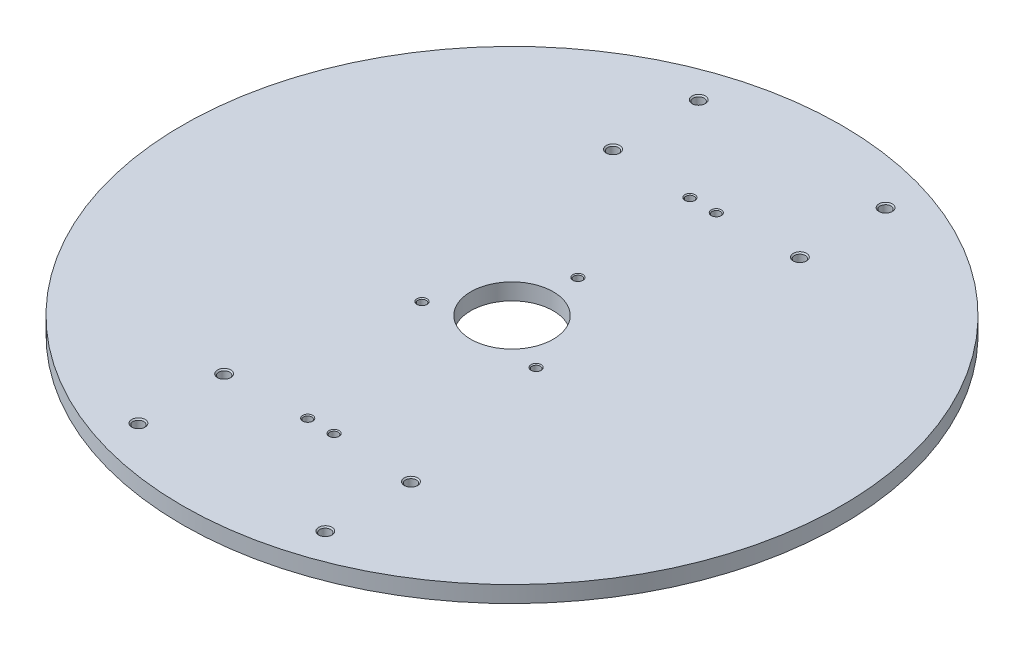
ISO-10303-21;
HEADER;
FILE_DESCRIPTION(('STEP AP214'),'2;1');
FILE_NAME('part.step','',(''),(''),'','','');
FILE_SCHEMA(('AUTOMOTIVE_DESIGN { 1 0 10303 214 1 1 1 1 }'));
ENDSEC;
DATA;
#1=APPLICATION_CONTEXT('core data for automotive mechanical design processes');
#2=APPLICATION_PROTOCOL_DEFINITION('international standard','automotive_design',2000,#1);
#3=PRODUCT_CONTEXT('',#1,'mechanical');
#4=PRODUCT('Part','Part','',(#3));
#5=PRODUCT_RELATED_PRODUCT_CATEGORY('part','',(#4));
#6=PRODUCT_DEFINITION_FORMATION('','',#4);
#7=PRODUCT_DEFINITION_CONTEXT('part definition',#1,'design');
#8=PRODUCT_DEFINITION('design','',#6,#7);
#9=PRODUCT_DEFINITION_SHAPE('','',#8);
#10=(LENGTH_UNIT() NAMED_UNIT(*) SI_UNIT(.MILLI.,.METRE.));
#11=(NAMED_UNIT(*) PLANE_ANGLE_UNIT() SI_UNIT($,.RADIAN.));
#12=(NAMED_UNIT(*) SI_UNIT($,.STERADIAN.) SOLID_ANGLE_UNIT());
#13=UNCERTAINTY_MEASURE_WITH_UNIT(LENGTH_MEASURE(1.E-05),#10,'distance_accuracy_value','');
#14=(GEOMETRIC_REPRESENTATION_CONTEXT(3) GLOBAL_UNCERTAINTY_ASSIGNED_CONTEXT((#13)) GLOBAL_UNIT_ASSIGNED_CONTEXT((#10,
#11,#12)) REPRESENTATION_CONTEXT('',''));
#15=CARTESIAN_POINT('',(0.,0.,0.));
#16=DIRECTION('',(0.,0.,1.));
#17=DIRECTION('',(1.,0.,0.));
#18=AXIS2_PLACEMENT_3D('',#15,#16,#17);
#19=CARTESIAN_POINT('',(0.,5.,0.));
#20=DIRECTION('',(0.,-1.,0.));
#21=DIRECTION('',(0.,0.,-1.));
#22=AXIS2_PLACEMENT_3D('',#19,#20,#21);
#23=CYLINDRICAL_SURFACE('',#22,100.);
#24=CARTESIAN_POINT('',(0.,5.,0.));
#25=DIRECTION('',(0.,1.,0.));
#26=DIRECTION('',(0.,0.,1.));
#27=AXIS2_PLACEMENT_3D('',#24,#25,#26);
#28=CIRCLE('',#27,100.);
#29=CARTESIAN_POINT('',(0.,5.,100.));
#30=VERTEX_POINT('',#29);
#31=EDGE_CURVE('E10',#30,#30,#28,.T.);
#32=ORIENTED_EDGE('',*,*,#31,.F.);
#33=EDGE_LOOP('',(#32));
#34=FACE_BOUND('',#33,.T.);
#35=CARTESIAN_POINT('',(0.,0.,0.));
#36=DIRECTION('',(0.,1.,0.));
#37=DIRECTION('',(0.,0.,1.));
#38=AXIS2_PLACEMENT_3D('',#35,#36,#37);
#39=CIRCLE('',#38,100.);
#40=CARTESIAN_POINT('',(0.,0.,100.));
#41=VERTEX_POINT('',#40);
#42=EDGE_CURVE('E42',#41,#41,#39,.T.);
#43=ORIENTED_EDGE('',*,*,#42,.T.);
#44=EDGE_LOOP('',(#43));
#45=FACE_BOUND('',#44,.T.);
#46=ADVANCED_FACE('F39',(#34,#45),#23,.T.);
#47=CARTESIAN_POINT('',(0.,5.,0.));
#48=DIRECTION('',(0.,1.,0.));
#49=DIRECTION('',(0.,0.,1.));
#50=AXIS2_PLACEMENT_3D('',#47,#48,#49);
#51=PLANE('',#50);
#52=CARTESIAN_POINT('',(-4.,5.,-58.));
#53=DIRECTION('',(0.,1.,0.));
#54=DIRECTION('',(0.,0.,1.));
#55=AXIS2_PLACEMENT_3D('',#52,#53,#54);
#56=CIRCLE('',#55,1.525);
#57=CARTESIAN_POINT('',(-4.,5.,-56.475));
#58=VERTEX_POINT('',#57);
#59=EDGE_CURVE('E188',#58,#58,#56,.T.);
#60=ORIENTED_EDGE('',*,*,#59,.F.);
#61=EDGE_LOOP('',(#60));
#62=FACE_BOUND('',#61,.T.);
#63=CARTESIAN_POINT('',(4.,5.,-58.));
#64=DIRECTION('',(0.,1.,0.));
#65=DIRECTION('',(0.,0.,1.));
#66=AXIS2_PLACEMENT_3D('',#63,#64,#65);
#67=CIRCLE('',#66,1.525);
#68=CARTESIAN_POINT('',(4.,5.,-56.475));
#69=VERTEX_POINT('',#68);
#70=EDGE_CURVE('E179',#69,#69,#67,.T.);
#71=ORIENTED_EDGE('',*,*,#70,.F.);
#72=EDGE_LOOP('',(#71));
#73=FACE_BOUND('',#72,.T.);
#74=CARTESIAN_POINT('',(-4.,5.,58.));
#75=DIRECTION('',(0.,1.,0.));
#76=DIRECTION('',(0.,0.,1.));
#77=AXIS2_PLACEMENT_3D('',#74,#75,#76);
#78=CIRCLE('',#77,1.525);
#79=CARTESIAN_POINT('',(-4.,5.,59.525));
#80=VERTEX_POINT('',#79);
#81=EDGE_CURVE('E170',#80,#80,#78,.T.);
#82=ORIENTED_EDGE('',*,*,#81,.F.);
#83=EDGE_LOOP('',(#82));
#84=FACE_BOUND('',#83,.T.);
#85=CARTESIAN_POINT('',(4.,5.,58.));
#86=DIRECTION('',(0.,1.,0.));
#87=DIRECTION('',(0.,0.,1.));
#88=AXIS2_PLACEMENT_3D('',#85,#86,#87);
#89=CIRCLE('',#88,1.525);
#90=CARTESIAN_POINT('',(4.,5.,59.525));
#91=VERTEX_POINT('',#90);
#92=EDGE_CURVE('E161',#91,#91,#89,.T.);
#93=ORIENTED_EDGE('',*,*,#92,.F.);
#94=EDGE_LOOP('',(#93));
#95=FACE_BOUND('',#94,.T.);
#96=CARTESIAN_POINT('',(-28.35,5.,-85.));
#97=DIRECTION('',(0.,1.,0.));
#98=DIRECTION('',(0.,0.,1.));
#99=AXIS2_PLACEMENT_3D('',#96,#97,#98);
#100=CIRCLE('',#99,2.025);
#101=CARTESIAN_POINT('',(-28.35,5.,-82.975));
#102=VERTEX_POINT('',#101);
#103=EDGE_CURVE('E152',#102,#102,#100,.T.);
#104=ORIENTED_EDGE('',*,*,#103,.F.);
#105=EDGE_LOOP('',(#104));
#106=FACE_BOUND('',#105,.T.);
#107=CARTESIAN_POINT('',(28.35,5.,-85.));
#108=DIRECTION('',(0.,1.,0.));
#109=DIRECTION('',(0.,0.,1.));
#110=AXIS2_PLACEMENT_3D('',#107,#108,#109);
#111=CIRCLE('',#110,2.025);
#112=CARTESIAN_POINT('',(28.35,5.,-82.975));
#113=VERTEX_POINT('',#112);
#114=EDGE_CURVE('E143',#113,#113,#111,.T.);
#115=ORIENTED_EDGE('',*,*,#114,.F.);
#116=EDGE_LOOP('',(#115));
#117=FACE_BOUND('',#116,.T.);
#118=CARTESIAN_POINT('',(28.35,5.,85.));
#119=DIRECTION('',(0.,1.,0.));
#120=DIRECTION('',(0.,0.,1.));
#121=AXIS2_PLACEMENT_3D('',#118,#119,#120);
#122=CIRCLE('',#121,2.025);
#123=CARTESIAN_POINT('',(28.35,5.,87.025));
#124=VERTEX_POINT('',#123);
#125=EDGE_CURVE('E134',#124,#124,#122,.T.);
#126=ORIENTED_EDGE('',*,*,#125,.F.);
#127=EDGE_LOOP('',(#126));
#128=FACE_BOUND('',#127,.T.);
#129=CARTESIAN_POINT('',(-28.35,5.,85.));
#130=DIRECTION('',(0.,1.,0.));
#131=DIRECTION('',(0.,0.,1.));
#132=AXIS2_PLACEMENT_3D('',#129,#130,#131);
#133=CIRCLE('',#132,2.025);
#134=CARTESIAN_POINT('',(-28.35,5.,87.025));
#135=VERTEX_POINT('',#134);
#136=EDGE_CURVE('E125',#135,#135,#133,.T.);
#137=ORIENTED_EDGE('',*,*,#136,.F.);
#138=EDGE_LOOP('',(#137));
#139=FACE_BOUND('',#138,.T.);
#140=CARTESIAN_POINT('',(-28.35,5.,-59.));
#141=DIRECTION('',(0.,1.,0.));
#142=DIRECTION('',(0.,0.,1.));
#143=AXIS2_PLACEMENT_3D('',#140,#141,#142);
#144=CIRCLE('',#143,2.025);
#145=CARTESIAN_POINT('',(-28.35,5.,-56.975));
#146=VERTEX_POINT('',#145);
#147=EDGE_CURVE('E116',#146,#146,#144,.T.);
#148=ORIENTED_EDGE('',*,*,#147,.F.);
#149=EDGE_LOOP('',(#148));
#150=FACE_BOUND('',#149,.T.);
#151=CARTESIAN_POINT('',(28.35,5.,-59.));
#152=DIRECTION('',(0.,1.,0.));
#153=DIRECTION('',(0.,0.,1.));
#154=AXIS2_PLACEMENT_3D('',#151,#152,#153);
#155=CIRCLE('',#154,2.025);
#156=CARTESIAN_POINT('',(28.35,5.,-56.975));
#157=VERTEX_POINT('',#156);
#158=EDGE_CURVE('E107',#157,#157,#155,.T.);
#159=ORIENTED_EDGE('',*,*,#158,.F.);
#160=EDGE_LOOP('',(#159));
#161=FACE_BOUND('',#160,.T.);
#162=CARTESIAN_POINT('',(-28.35,5.,59.));
#163=DIRECTION('',(0.,1.,0.));
#164=DIRECTION('',(0.,0.,1.));
#165=AXIS2_PLACEMENT_3D('',#162,#163,#164);
#166=CIRCLE('',#165,2.025);
#167=CARTESIAN_POINT('',(-28.35,5.,61.025));
#168=VERTEX_POINT('',#167);
#169=EDGE_CURVE('E98',#168,#168,#166,.T.);
#170=ORIENTED_EDGE('',*,*,#169,.F.);
#171=EDGE_LOOP('',(#170));
#172=FACE_BOUND('',#171,.T.);
#173=CARTESIAN_POINT('',(28.35,5.,59.));
#174=DIRECTION('',(0.,1.,0.));
#175=DIRECTION('',(0.,0.,1.));
#176=AXIS2_PLACEMENT_3D('',#173,#174,#175);
#177=CIRCLE('',#176,2.025);
#178=CARTESIAN_POINT('',(28.35,5.,61.025));
#179=VERTEX_POINT('',#178);
#180=EDGE_CURVE('E89',#179,#179,#177,.T.);
#181=ORIENTED_EDGE('',*,*,#180,.F.);
#182=EDGE_LOOP('',(#181));
#183=FACE_BOUND('',#182,.T.);
#184=CARTESIAN_POINT('',(0.,5.,0.));
#185=DIRECTION('',(0.,1.,0.));
#186=DIRECTION('',(0.,0.,1.));
#187=AXIS2_PLACEMENT_3D('',#184,#185,#186);
#188=CIRCLE('',#187,12.5);
#189=CARTESIAN_POINT('',(0.,5.,12.5));
#190=VERTEX_POINT('',#189);
#191=EDGE_CURVE('E78',#190,#190,#188,.T.);
#192=ORIENTED_EDGE('',*,*,#191,.F.);
#193=EDGE_LOOP('',(#192));
#194=FACE_BOUND('',#193,.T.);
#195=CARTESIAN_POINT('',(0.,5.,-20.));
#196=DIRECTION('',(0.,1.,0.));
#197=DIRECTION('',(0.,0.,1.));
#198=AXIS2_PLACEMENT_3D('',#195,#196,#197);
#199=CIRCLE('',#198,1.525);
#200=CARTESIAN_POINT('',(0.,5.,-18.475));
#201=VERTEX_POINT('',#200);
#202=EDGE_CURVE('E74',#201,#201,#199,.T.);
#203=ORIENTED_EDGE('',*,*,#202,.F.);
#204=EDGE_LOOP('',(#203));
#205=FACE_BOUND('',#204,.T.);
#206=CARTESIAN_POINT('',(17.3205080756888,5.,9.99999999999996));
#207=DIRECTION('',(0.,1.,0.));
#208=DIRECTION('',(0.,0.,1.));
#209=AXIS2_PLACEMENT_3D('',#206,#207,#208);
#210=CIRCLE('',#209,1.525);
#211=CARTESIAN_POINT('',(17.3205080756888,5.,11.525));
#212=VERTEX_POINT('',#211);
#213=EDGE_CURVE('E65',#212,#212,#210,.T.);
#214=ORIENTED_EDGE('',*,*,#213,.F.);
#215=EDGE_LOOP('',(#214));
#216=FACE_BOUND('',#215,.T.);
#217=CARTESIAN_POINT('',(-17.3205080756888,5.,9.99999999999997));
#218=DIRECTION('',(0.,1.,0.));
#219=DIRECTION('',(0.,0.,1.));
#220=AXIS2_PLACEMENT_3D('',#217,#218,#219);
#221=CIRCLE('',#220,1.525);
#222=CARTESIAN_POINT('',(-17.3205080756888,5.,11.525));
#223=VERTEX_POINT('',#222);
#224=EDGE_CURVE('E56',#223,#223,#221,.T.);
#225=ORIENTED_EDGE('',*,*,#224,.F.);
#226=EDGE_LOOP('',(#225));
#227=FACE_BOUND('',#226,.T.);
#228=ORIENTED_EDGE('',*,*,#31,.T.);
#229=EDGE_LOOP('',(#228));
#230=FACE_BOUND('',#229,.T.);
#231=ADVANCED_FACE('F194',(#62,#73,#84,#95,#106,#117,#128,#139,#150,#161,#172,#183,#194,#205,
#216,#227,#230),#51,.T.);
#232=CARTESIAN_POINT('',(0.,0.,0.));
#233=DIRECTION('',(0.,1.,0.));
#234=DIRECTION('',(0.,0.,1.));
#235=AXIS2_PLACEMENT_3D('',#232,#233,#234);
#236=PLANE('',#235);
#237=CARTESIAN_POINT('',(-4.,0.,-58.));
#238=DIRECTION('',(0.,1.,0.));
#239=DIRECTION('',(0.,0.,1.));
#240=AXIS2_PLACEMENT_3D('',#237,#238,#239);
#241=CIRCLE('',#240,1.24999999999999);
#242=CARTESIAN_POINT('',(-4.,0.,-56.75));
#243=VERTEX_POINT('',#242);
#244=EDGE_CURVE('E182',#243,#243,#241,.T.);
#245=ORIENTED_EDGE('',*,*,#244,.T.);
#246=EDGE_LOOP('',(#245));
#247=FACE_BOUND('',#246,.T.);
#248=CARTESIAN_POINT('',(4.,0.,-58.));
#249=DIRECTION('',(0.,1.,0.));
#250=DIRECTION('',(0.,0.,1.));
#251=AXIS2_PLACEMENT_3D('',#248,#249,#250);
#252=CIRCLE('',#251,1.24999999999999);
#253=CARTESIAN_POINT('',(4.,0.,-56.75));
#254=VERTEX_POINT('',#253);
#255=EDGE_CURVE('E173',#254,#254,#252,.T.);
#256=ORIENTED_EDGE('',*,*,#255,.T.);
#257=EDGE_LOOP('',(#256));
#258=FACE_BOUND('',#257,.T.);
#259=CARTESIAN_POINT('',(-4.,0.,58.));
#260=DIRECTION('',(0.,1.,0.));
#261=DIRECTION('',(0.,0.,1.));
#262=AXIS2_PLACEMENT_3D('',#259,#260,#261);
#263=CIRCLE('',#262,1.24999999999999);
#264=CARTESIAN_POINT('',(-4.,0.,59.25));
#265=VERTEX_POINT('',#264);
#266=EDGE_CURVE('E164',#265,#265,#263,.T.);
#267=ORIENTED_EDGE('',*,*,#266,.T.);
#268=EDGE_LOOP('',(#267));
#269=FACE_BOUND('',#268,.T.);
#270=CARTESIAN_POINT('',(4.,0.,58.));
#271=DIRECTION('',(0.,1.,0.));
#272=DIRECTION('',(0.,0.,1.));
#273=AXIS2_PLACEMENT_3D('',#270,#271,#272);
#274=CIRCLE('',#273,1.24999999999999);
#275=CARTESIAN_POINT('',(4.,0.,59.25));
#276=VERTEX_POINT('',#275);
#277=EDGE_CURVE('E155',#276,#276,#274,.T.);
#278=ORIENTED_EDGE('',*,*,#277,.T.);
#279=EDGE_LOOP('',(#278));
#280=FACE_BOUND('',#279,.T.);
#281=CARTESIAN_POINT('',(-28.35,0.,-85.));
#282=DIRECTION('',(0.,1.,0.));
#283=DIRECTION('',(0.,0.,1.));
#284=AXIS2_PLACEMENT_3D('',#281,#282,#283);
#285=CIRCLE('',#284,1.64999999999999);
#286=CARTESIAN_POINT('',(-28.35,0.,-83.35));
#287=VERTEX_POINT('',#286);
#288=EDGE_CURVE('E146',#287,#287,#285,.T.);
#289=ORIENTED_EDGE('',*,*,#288,.T.);
#290=EDGE_LOOP('',(#289));
#291=FACE_BOUND('',#290,.T.);
#292=CARTESIAN_POINT('',(28.35,0.,-85.));
#293=DIRECTION('',(0.,1.,0.));
#294=DIRECTION('',(0.,0.,1.));
#295=AXIS2_PLACEMENT_3D('',#292,#293,#294);
#296=CIRCLE('',#295,1.64999999999999);
#297=CARTESIAN_POINT('',(28.35,0.,-83.35));
#298=VERTEX_POINT('',#297);
#299=EDGE_CURVE('E137',#298,#298,#296,.T.);
#300=ORIENTED_EDGE('',*,*,#299,.T.);
#301=EDGE_LOOP('',(#300));
#302=FACE_BOUND('',#301,.T.);
#303=CARTESIAN_POINT('',(28.35,0.,85.));
#304=DIRECTION('',(0.,1.,0.));
#305=DIRECTION('',(0.,0.,1.));
#306=AXIS2_PLACEMENT_3D('',#303,#304,#305);
#307=CIRCLE('',#306,1.64999999999999);
#308=CARTESIAN_POINT('',(28.35,0.,86.65));
#309=VERTEX_POINT('',#308);
#310=EDGE_CURVE('E128',#309,#309,#307,.T.);
#311=ORIENTED_EDGE('',*,*,#310,.T.);
#312=EDGE_LOOP('',(#311));
#313=FACE_BOUND('',#312,.T.);
#314=CARTESIAN_POINT('',(-28.35,0.,85.));
#315=DIRECTION('',(0.,1.,0.));
#316=DIRECTION('',(0.,0.,1.));
#317=AXIS2_PLACEMENT_3D('',#314,#315,#316);
#318=CIRCLE('',#317,1.64999999999999);
#319=CARTESIAN_POINT('',(-28.35,0.,86.65));
#320=VERTEX_POINT('',#319);
#321=EDGE_CURVE('E119',#320,#320,#318,.T.);
#322=ORIENTED_EDGE('',*,*,#321,.T.);
#323=EDGE_LOOP('',(#322));
#324=FACE_BOUND('',#323,.T.);
#325=CARTESIAN_POINT('',(-28.35,0.,-59.));
#326=DIRECTION('',(0.,1.,0.));
#327=DIRECTION('',(0.,0.,1.));
#328=AXIS2_PLACEMENT_3D('',#325,#326,#327);
#329=CIRCLE('',#328,1.64999999999999);
#330=CARTESIAN_POINT('',(-28.35,0.,-57.35));
#331=VERTEX_POINT('',#330);
#332=EDGE_CURVE('E110',#331,#331,#329,.T.);
#333=ORIENTED_EDGE('',*,*,#332,.T.);
#334=EDGE_LOOP('',(#333));
#335=FACE_BOUND('',#334,.T.);
#336=CARTESIAN_POINT('',(28.35,0.,-59.));
#337=DIRECTION('',(0.,1.,0.));
#338=DIRECTION('',(0.,0.,1.));
#339=AXIS2_PLACEMENT_3D('',#336,#337,#338);
#340=CIRCLE('',#339,1.64999999999999);
#341=CARTESIAN_POINT('',(28.35,0.,-57.35));
#342=VERTEX_POINT('',#341);
#343=EDGE_CURVE('E101',#342,#342,#340,.T.);
#344=ORIENTED_EDGE('',*,*,#343,.T.);
#345=EDGE_LOOP('',(#344));
#346=FACE_BOUND('',#345,.T.);
#347=CARTESIAN_POINT('',(-28.35,0.,59.));
#348=DIRECTION('',(0.,1.,0.));
#349=DIRECTION('',(0.,0.,1.));
#350=AXIS2_PLACEMENT_3D('',#347,#348,#349);
#351=CIRCLE('',#350,1.64999999999999);
#352=CARTESIAN_POINT('',(-28.35,0.,60.65));
#353=VERTEX_POINT('',#352);
#354=EDGE_CURVE('E92',#353,#353,#351,.T.);
#355=ORIENTED_EDGE('',*,*,#354,.T.);
#356=EDGE_LOOP('',(#355));
#357=FACE_BOUND('',#356,.T.);
#358=CARTESIAN_POINT('',(28.35,0.,59.));
#359=DIRECTION('',(0.,1.,0.));
#360=DIRECTION('',(0.,0.,1.));
#361=AXIS2_PLACEMENT_3D('',#358,#359,#360);
#362=CIRCLE('',#361,1.64999999999999);
#363=CARTESIAN_POINT('',(28.35,0.,60.65));
#364=VERTEX_POINT('',#363);
#365=EDGE_CURVE('E81',#364,#364,#362,.T.);
#366=ORIENTED_EDGE('',*,*,#365,.T.);
#367=EDGE_LOOP('',(#366));
#368=FACE_BOUND('',#367,.T.);
#369=CARTESIAN_POINT('',(0.,0.,0.));
#370=DIRECTION('',(0.,1.,0.));
#371=DIRECTION('',(0.,0.,1.));
#372=AXIS2_PLACEMENT_3D('',#369,#370,#371);
#373=CIRCLE('',#372,12.5);
#374=CARTESIAN_POINT('',(0.,0.,12.5));
#375=VERTEX_POINT('',#374);
#376=EDGE_CURVE('E77',#375,#375,#373,.T.);
#377=ORIENTED_EDGE('',*,*,#376,.T.);
#378=EDGE_LOOP('',(#377));
#379=FACE_BOUND('',#378,.T.);
#380=CARTESIAN_POINT('',(0.,0.,-20.));
#381=DIRECTION('',(0.,1.,0.));
#382=DIRECTION('',(0.,0.,1.));
#383=AXIS2_PLACEMENT_3D('',#380,#381,#382);
#384=CIRCLE('',#383,1.25);
#385=CARTESIAN_POINT('',(0.,0.,-18.75));
#386=VERTEX_POINT('',#385);
#387=EDGE_CURVE('E68',#386,#386,#384,.T.);
#388=ORIENTED_EDGE('',*,*,#387,.T.);
#389=EDGE_LOOP('',(#388));
#390=FACE_BOUND('',#389,.T.);
#391=CARTESIAN_POINT('',(17.3205080756888,0.,9.99999999999996));
#392=DIRECTION('',(0.,1.,0.));
#393=DIRECTION('',(0.,0.,1.));
#394=AXIS2_PLACEMENT_3D('',#391,#392,#393);
#395=CIRCLE('',#394,1.25);
#396=CARTESIAN_POINT('',(17.3205080756888,0.,11.25));
#397=VERTEX_POINT('',#396);
#398=EDGE_CURVE('E59',#397,#397,#395,.T.);
#399=ORIENTED_EDGE('',*,*,#398,.T.);
#400=EDGE_LOOP('',(#399));
#401=FACE_BOUND('',#400,.T.);
#402=CARTESIAN_POINT('',(-17.3205080756888,0.,9.99999999999997));
#403=DIRECTION('',(0.,1.,0.));
#404=DIRECTION('',(0.,0.,1.));
#405=AXIS2_PLACEMENT_3D('',#402,#403,#404);
#406=CIRCLE('',#405,1.25);
#407=CARTESIAN_POINT('',(-17.3205080756888,0.,11.25));
#408=VERTEX_POINT('',#407);
#409=EDGE_CURVE('E49',#408,#408,#406,.T.);
#410=ORIENTED_EDGE('',*,*,#409,.T.);
#411=EDGE_LOOP('',(#410));
#412=FACE_BOUND('',#411,.T.);
#413=ORIENTED_EDGE('',*,*,#42,.F.);
#414=EDGE_LOOP('',(#413));
#415=FACE_BOUND('',#414,.T.);
#416=ADVANCED_FACE('F197',(#247,#258,#269,#280,#291,#302,#313,#324,#335,#346,#357,#368,#379,
#390,#401,#412,#415),#236,.F.);
#417=CARTESIAN_POINT('',(-17.3205080756888,5.,9.99999999999997));
#418=DIRECTION('',(0.,1.,0.));
#419=DIRECTION('',(0.,0.,1.));
#420=AXIS2_PLACEMENT_3D('',#417,#418,#419);
#421=CYLINDRICAL_SURFACE('',#420,1.25);
#422=ORIENTED_EDGE('',*,*,#409,.F.);
#423=EDGE_LOOP('',(#422));
#424=FACE_BOUND('',#423,.T.);
#425=CARTESIAN_POINT('',(-17.3205080756888,4.725,9.99999999999997));
#426=DIRECTION('',(0.,1.,0.));
#427=DIRECTION('',(0.,0.,1.));
#428=AXIS2_PLACEMENT_3D('',#425,#426,#427);
#429=CIRCLE('',#428,1.25);
#430=CARTESIAN_POINT('',(-17.3205080756888,4.725,11.25));
#431=VERTEX_POINT('',#430);
#432=EDGE_CURVE('E53',#431,#431,#429,.T.);
#433=ORIENTED_EDGE('',*,*,#432,.T.);
#434=EDGE_LOOP('',(#433));
#435=FACE_BOUND('',#434,.T.);
#436=ADVANCED_FACE('F232',(#424,#435),#421,.F.);
#437=CARTESIAN_POINT('',(-17.3205080756888,5.,9.99999999999997));
#438=DIRECTION('',(0.,1.,0.));
#439=DIRECTION('',(0.,0.,1.));
#440=AXIS2_PLACEMENT_3D('',#437,#438,#439);
#441=CONICAL_SURFACE('',#440,1.525,0.785398163397439);
#442=ORIENTED_EDGE('',*,*,#432,.F.);
#443=EDGE_LOOP('',(#442));
#444=FACE_BOUND('',#443,.T.);
#445=ORIENTED_EDGE('',*,*,#224,.T.);
#446=EDGE_LOOP('',(#445));
#447=FACE_BOUND('',#446,.T.);
#448=ADVANCED_FACE('F229',(#444,#447),#441,.F.);
#449=CARTESIAN_POINT('',(17.3205080756888,5.,9.99999999999996));
#450=DIRECTION('',(0.,1.,0.));
#451=DIRECTION('',(0.,0.,1.));
#452=AXIS2_PLACEMENT_3D('',#449,#450,#451);
#453=CYLINDRICAL_SURFACE('',#452,1.25);
#454=ORIENTED_EDGE('',*,*,#398,.F.);
#455=EDGE_LOOP('',(#454));
#456=FACE_BOUND('',#455,.T.);
#457=CARTESIAN_POINT('',(17.3205080756888,4.725,9.99999999999996));
#458=DIRECTION('',(0.,1.,0.));
#459=DIRECTION('',(0.,0.,1.));
#460=AXIS2_PLACEMENT_3D('',#457,#458,#459);
#461=CIRCLE('',#460,1.25);
#462=CARTESIAN_POINT('',(17.3205080756888,4.725,11.25));
#463=VERTEX_POINT('',#462);
#464=EDGE_CURVE('E62',#463,#463,#461,.T.);
#465=ORIENTED_EDGE('',*,*,#464,.T.);
#466=EDGE_LOOP('',(#465));
#467=FACE_BOUND('',#466,.T.);
#468=ADVANCED_FACE('F231',(#456,#467),#453,.F.);
#469=CARTESIAN_POINT('',(17.3205080756888,5.,9.99999999999996));
#470=DIRECTION('',(0.,1.,0.));
#471=DIRECTION('',(0.,0.,1.));
#472=AXIS2_PLACEMENT_3D('',#469,#470,#471);
#473=CONICAL_SURFACE('',#472,1.525,0.785398163397439);
#474=ORIENTED_EDGE('',*,*,#464,.F.);
#475=EDGE_LOOP('',(#474));
#476=FACE_BOUND('',#475,.T.);
#477=ORIENTED_EDGE('',*,*,#213,.T.);
#478=EDGE_LOOP('',(#477));
#479=FACE_BOUND('',#478,.T.);
#480=ADVANCED_FACE('F240',(#476,#479),#473,.F.);
#481=CARTESIAN_POINT('',(0.,5.,-20.));
#482=DIRECTION('',(0.,1.,0.));
#483=DIRECTION('',(0.,0.,1.));
#484=AXIS2_PLACEMENT_3D('',#481,#482,#483);
#485=CYLINDRICAL_SURFACE('',#484,1.25);
#486=ORIENTED_EDGE('',*,*,#387,.F.);
#487=EDGE_LOOP('',(#486));
#488=FACE_BOUND('',#487,.T.);
#489=CARTESIAN_POINT('',(0.,4.725,-20.));
#490=DIRECTION('',(0.,1.,0.));
#491=DIRECTION('',(0.,0.,1.));
#492=AXIS2_PLACEMENT_3D('',#489,#490,#491);
#493=CIRCLE('',#492,1.25);
#494=CARTESIAN_POINT('',(0.,4.725,-18.75));
#495=VERTEX_POINT('',#494);
#496=EDGE_CURVE('E71',#495,#495,#493,.T.);
#497=ORIENTED_EDGE('',*,*,#496,.T.);
#498=EDGE_LOOP('',(#497));
#499=FACE_BOUND('',#498,.T.);
#500=ADVANCED_FACE('F296',(#488,#499),#485,.F.);
#501=CARTESIAN_POINT('',(0.,5.,-20.));
#502=DIRECTION('',(0.,1.,0.));
#503=DIRECTION('',(0.,0.,1.));
#504=AXIS2_PLACEMENT_3D('',#501,#502,#503);
#505=CONICAL_SURFACE('',#504,1.525,0.785398163397445);
#506=ORIENTED_EDGE('',*,*,#496,.F.);
#507=EDGE_LOOP('',(#506));
#508=FACE_BOUND('',#507,.T.);
#509=ORIENTED_EDGE('',*,*,#202,.T.);
#510=EDGE_LOOP('',(#509));
#511=FACE_BOUND('',#510,.T.);
#512=ADVANCED_FACE('F302',(#508,#511),#505,.F.);
#513=CARTESIAN_POINT('',(0.,0.,0.));
#514=DIRECTION('',(0.,1.,0.));
#515=DIRECTION('',(0.,0.,1.));
#516=AXIS2_PLACEMENT_3D('',#513,#514,#515);
#517=CYLINDRICAL_SURFACE('',#516,12.5);
#518=ORIENTED_EDGE('',*,*,#376,.F.);
#519=EDGE_LOOP('',(#518));
#520=FACE_BOUND('',#519,.T.);
#521=ORIENTED_EDGE('',*,*,#191,.T.);
#522=EDGE_LOOP('',(#521));
#523=FACE_BOUND('',#522,.T.);
#524=ADVANCED_FACE('F308',(#520,#523),#517,.F.);
#525=CARTESIAN_POINT('',(28.35,5.,59.));
#526=DIRECTION('',(0.,1.,0.));
#527=DIRECTION('',(0.,0.,1.));
#528=AXIS2_PLACEMENT_3D('',#525,#526,#527);
#529=CYLINDRICAL_SURFACE('',#528,1.64999999999999);
#530=ORIENTED_EDGE('',*,*,#365,.F.);
#531=EDGE_LOOP('',(#530));
#532=FACE_BOUND('',#531,.T.);
#533=CARTESIAN_POINT('',(28.35,4.625,59.));
#534=DIRECTION('',(0.,1.,0.));
#535=DIRECTION('',(0.,0.,1.));
#536=AXIS2_PLACEMENT_3D('',#533,#534,#535);
#537=CIRCLE('',#536,1.64999999999999);
#538=CARTESIAN_POINT('',(28.35,4.625,60.65));
#539=VERTEX_POINT('',#538);
#540=EDGE_CURVE('E86',#539,#539,#537,.T.);
#541=ORIENTED_EDGE('',*,*,#540,.T.);
#542=EDGE_LOOP('',(#541));
#543=FACE_BOUND('',#542,.T.);
#544=ADVANCED_FACE('F312',(#532,#543),#529,.F.);
#545=CARTESIAN_POINT('',(28.35,5.,59.));
#546=DIRECTION('',(0.,1.,0.));
#547=DIRECTION('',(0.,0.,1.));
#548=AXIS2_PLACEMENT_3D('',#545,#546,#547);
#549=CONICAL_SURFACE('',#548,2.025,0.78539816339746);
#550=ORIENTED_EDGE('',*,*,#540,.F.);
#551=EDGE_LOOP('',(#550));
#552=FACE_BOUND('',#551,.T.);
#553=ORIENTED_EDGE('',*,*,#180,.T.);
#554=EDGE_LOOP('',(#553));
#555=FACE_BOUND('',#554,.T.);
#556=ADVANCED_FACE('F316',(#552,#555),#549,.F.);
#557=CARTESIAN_POINT('',(-28.35,5.,59.));
#558=DIRECTION('',(0.,1.,0.));
#559=DIRECTION('',(0.,0.,1.));
#560=AXIS2_PLACEMENT_3D('',#557,#558,#559);
#561=CYLINDRICAL_SURFACE('',#560,1.64999999999999);
#562=ORIENTED_EDGE('',*,*,#354,.F.);
#563=EDGE_LOOP('',(#562));
#564=FACE_BOUND('',#563,.T.);
#565=CARTESIAN_POINT('',(-28.35,4.625,59.));
#566=DIRECTION('',(0.,1.,0.));
#567=DIRECTION('',(0.,0.,1.));
#568=AXIS2_PLACEMENT_3D('',#565,#566,#567);
#569=CIRCLE('',#568,1.64999999999999);
#570=CARTESIAN_POINT('',(-28.35,4.625,60.65));
#571=VERTEX_POINT('',#570);
#572=EDGE_CURVE('E95',#571,#571,#569,.T.);
#573=ORIENTED_EDGE('',*,*,#572,.T.);
#574=EDGE_LOOP('',(#573));
#575=FACE_BOUND('',#574,.T.);
#576=ADVANCED_FACE('F320',(#564,#575),#561,.F.);
#577=CARTESIAN_POINT('',(-28.35,5.,59.));
#578=DIRECTION('',(0.,1.,0.));
#579=DIRECTION('',(0.,0.,1.));
#580=AXIS2_PLACEMENT_3D('',#577,#578,#579);
#581=CONICAL_SURFACE('',#580,2.025,0.78539816339746);
#582=ORIENTED_EDGE('',*,*,#572,.F.);
#583=EDGE_LOOP('',(#582));
#584=FACE_BOUND('',#583,.T.);
#585=ORIENTED_EDGE('',*,*,#169,.T.);
#586=EDGE_LOOP('',(#585));
#587=FACE_BOUND('',#586,.T.);
#588=ADVANCED_FACE('F324',(#584,#587),#581,.F.);
#589=CARTESIAN_POINT('',(28.35,5.,-59.));
#590=DIRECTION('',(0.,1.,0.));
#591=DIRECTION('',(0.,0.,1.));
#592=AXIS2_PLACEMENT_3D('',#589,#590,#591);
#593=CYLINDRICAL_SURFACE('',#592,1.64999999999999);
#594=ORIENTED_EDGE('',*,*,#343,.F.);
#595=EDGE_LOOP('',(#594));
#596=FACE_BOUND('',#595,.T.);
#597=CARTESIAN_POINT('',(28.35,4.625,-59.));
#598=DIRECTION('',(0.,1.,0.));
#599=DIRECTION('',(0.,0.,1.));
#600=AXIS2_PLACEMENT_3D('',#597,#598,#599);
#601=CIRCLE('',#600,1.64999999999999);
#602=CARTESIAN_POINT('',(28.35,4.625,-57.35));
#603=VERTEX_POINT('',#602);
#604=EDGE_CURVE('E104',#603,#603,#601,.T.);
#605=ORIENTED_EDGE('',*,*,#604,.T.);
#606=EDGE_LOOP('',(#605));
#607=FACE_BOUND('',#606,.T.);
#608=ADVANCED_FACE('F328',(#596,#607),#593,.F.);
#609=CARTESIAN_POINT('',(28.35,5.,-59.));
#610=DIRECTION('',(0.,1.,0.));
#611=DIRECTION('',(0.,0.,1.));
#612=AXIS2_PLACEMENT_3D('',#609,#610,#611);
#613=CONICAL_SURFACE('',#612,2.025,0.78539816339746);
#614=ORIENTED_EDGE('',*,*,#604,.F.);
#615=EDGE_LOOP('',(#614));
#616=FACE_BOUND('',#615,.T.);
#617=ORIENTED_EDGE('',*,*,#158,.T.);
#618=EDGE_LOOP('',(#617));
#619=FACE_BOUND('',#618,.T.);
#620=ADVANCED_FACE('F332',(#616,#619),#613,.F.);
#621=CARTESIAN_POINT('',(-28.35,5.,-59.));
#622=DIRECTION('',(0.,1.,0.));
#623=DIRECTION('',(0.,0.,1.));
#624=AXIS2_PLACEMENT_3D('',#621,#622,#623);
#625=CYLINDRICAL_SURFACE('',#624,1.64999999999999);
#626=ORIENTED_EDGE('',*,*,#332,.F.);
#627=EDGE_LOOP('',(#626));
#628=FACE_BOUND('',#627,.T.);
#629=CARTESIAN_POINT('',(-28.35,4.625,-59.));
#630=DIRECTION('',(0.,1.,0.));
#631=DIRECTION('',(0.,0.,1.));
#632=AXIS2_PLACEMENT_3D('',#629,#630,#631);
#633=CIRCLE('',#632,1.64999999999999);
#634=CARTESIAN_POINT('',(-28.35,4.625,-57.35));
#635=VERTEX_POINT('',#634);
#636=EDGE_CURVE('E113',#635,#635,#633,.T.);
#637=ORIENTED_EDGE('',*,*,#636,.T.);
#638=EDGE_LOOP('',(#637));
#639=FACE_BOUND('',#638,.T.);
#640=ADVANCED_FACE('F336',(#628,#639),#625,.F.);
#641=CARTESIAN_POINT('',(-28.35,5.,-59.));
#642=DIRECTION('',(0.,1.,0.));
#643=DIRECTION('',(0.,0.,1.));
#644=AXIS2_PLACEMENT_3D('',#641,#642,#643);
#645=CONICAL_SURFACE('',#644,2.025,0.78539816339746);
#646=ORIENTED_EDGE('',*,*,#636,.F.);
#647=EDGE_LOOP('',(#646));
#648=FACE_BOUND('',#647,.T.);
#649=ORIENTED_EDGE('',*,*,#147,.T.);
#650=EDGE_LOOP('',(#649));
#651=FACE_BOUND('',#650,.T.);
#652=ADVANCED_FACE('F340',(#648,#651),#645,.F.);
#653=CARTESIAN_POINT('',(-28.35,5.,85.));
#654=DIRECTION('',(0.,1.,0.));
#655=DIRECTION('',(0.,0.,1.));
#656=AXIS2_PLACEMENT_3D('',#653,#654,#655);
#657=CYLINDRICAL_SURFACE('',#656,1.64999999999999);
#658=ORIENTED_EDGE('',*,*,#321,.F.);
#659=EDGE_LOOP('',(#658));
#660=FACE_BOUND('',#659,.T.);
#661=CARTESIAN_POINT('',(-28.35,4.625,85.));
#662=DIRECTION('',(0.,1.,0.));
#663=DIRECTION('',(0.,0.,1.));
#664=AXIS2_PLACEMENT_3D('',#661,#662,#663);
#665=CIRCLE('',#664,1.64999999999999);
#666=CARTESIAN_POINT('',(-28.35,4.625,86.65));
#667=VERTEX_POINT('',#666);
#668=EDGE_CURVE('E122',#667,#667,#665,.T.);
#669=ORIENTED_EDGE('',*,*,#668,.T.);
#670=EDGE_LOOP('',(#669));
#671=FACE_BOUND('',#670,.T.);
#672=ADVANCED_FACE('F344',(#660,#671),#657,.F.);
#673=CARTESIAN_POINT('',(-28.35,5.,85.));
#674=DIRECTION('',(0.,1.,0.));
#675=DIRECTION('',(0.,0.,1.));
#676=AXIS2_PLACEMENT_3D('',#673,#674,#675);
#677=CONICAL_SURFACE('',#676,2.025,0.78539816339746);
#678=ORIENTED_EDGE('',*,*,#668,.F.);
#679=EDGE_LOOP('',(#678));
#680=FACE_BOUND('',#679,.T.);
#681=ORIENTED_EDGE('',*,*,#136,.T.);
#682=EDGE_LOOP('',(#681));
#683=FACE_BOUND('',#682,.T.);
#684=ADVANCED_FACE('F348',(#680,#683),#677,.F.);
#685=CARTESIAN_POINT('',(28.35,5.,85.));
#686=DIRECTION('',(0.,1.,0.));
#687=DIRECTION('',(0.,0.,1.));
#688=AXIS2_PLACEMENT_3D('',#685,#686,#687);
#689=CYLINDRICAL_SURFACE('',#688,1.64999999999999);
#690=ORIENTED_EDGE('',*,*,#310,.F.);
#691=EDGE_LOOP('',(#690));
#692=FACE_BOUND('',#691,.T.);
#693=CARTESIAN_POINT('',(28.35,4.625,85.));
#694=DIRECTION('',(0.,1.,0.));
#695=DIRECTION('',(0.,0.,1.));
#696=AXIS2_PLACEMENT_3D('',#693,#694,#695);
#697=CIRCLE('',#696,1.64999999999999);
#698=CARTESIAN_POINT('',(28.35,4.625,86.65));
#699=VERTEX_POINT('',#698);
#700=EDGE_CURVE('E131',#699,#699,#697,.T.);
#701=ORIENTED_EDGE('',*,*,#700,.T.);
#702=EDGE_LOOP('',(#701));
#703=FACE_BOUND('',#702,.T.);
#704=ADVANCED_FACE('F352',(#692,#703),#689,.F.);
#705=CARTESIAN_POINT('',(28.35,5.,85.));
#706=DIRECTION('',(0.,1.,0.));
#707=DIRECTION('',(0.,0.,1.));
#708=AXIS2_PLACEMENT_3D('',#705,#706,#707);
#709=CONICAL_SURFACE('',#708,2.025,0.78539816339746);
#710=ORIENTED_EDGE('',*,*,#700,.F.);
#711=EDGE_LOOP('',(#710));
#712=FACE_BOUND('',#711,.T.);
#713=ORIENTED_EDGE('',*,*,#125,.T.);
#714=EDGE_LOOP('',(#713));
#715=FACE_BOUND('',#714,.T.);
#716=ADVANCED_FACE('F356',(#712,#715),#709,.F.);
#717=CARTESIAN_POINT('',(28.35,5.,-85.));
#718=DIRECTION('',(0.,1.,0.));
#719=DIRECTION('',(0.,0.,1.));
#720=AXIS2_PLACEMENT_3D('',#717,#718,#719);
#721=CYLINDRICAL_SURFACE('',#720,1.64999999999999);
#722=ORIENTED_EDGE('',*,*,#299,.F.);
#723=EDGE_LOOP('',(#722));
#724=FACE_BOUND('',#723,.T.);
#725=CARTESIAN_POINT('',(28.35,4.625,-85.));
#726=DIRECTION('',(0.,1.,0.));
#727=DIRECTION('',(0.,0.,1.));
#728=AXIS2_PLACEMENT_3D('',#725,#726,#727);
#729=CIRCLE('',#728,1.64999999999999);
#730=CARTESIAN_POINT('',(28.35,4.625,-83.35));
#731=VERTEX_POINT('',#730);
#732=EDGE_CURVE('E140',#731,#731,#729,.T.);
#733=ORIENTED_EDGE('',*,*,#732,.T.);
#734=EDGE_LOOP('',(#733));
#735=FACE_BOUND('',#734,.T.);
#736=ADVANCED_FACE('F360',(#724,#735),#721,.F.);
#737=CARTESIAN_POINT('',(28.35,5.,-85.));
#738=DIRECTION('',(0.,1.,0.));
#739=DIRECTION('',(0.,0.,1.));
#740=AXIS2_PLACEMENT_3D('',#737,#738,#739);
#741=CONICAL_SURFACE('',#740,2.025,0.78539816339746);
#742=ORIENTED_EDGE('',*,*,#732,.F.);
#743=EDGE_LOOP('',(#742));
#744=FACE_BOUND('',#743,.T.);
#745=ORIENTED_EDGE('',*,*,#114,.T.);
#746=EDGE_LOOP('',(#745));
#747=FACE_BOUND('',#746,.T.);
#748=ADVANCED_FACE('F364',(#744,#747),#741,.F.);
#749=CARTESIAN_POINT('',(-28.35,5.,-85.));
#750=DIRECTION('',(0.,1.,0.));
#751=DIRECTION('',(0.,0.,1.));
#752=AXIS2_PLACEMENT_3D('',#749,#750,#751);
#753=CYLINDRICAL_SURFACE('',#752,1.64999999999999);
#754=ORIENTED_EDGE('',*,*,#288,.F.);
#755=EDGE_LOOP('',(#754));
#756=FACE_BOUND('',#755,.T.);
#757=CARTESIAN_POINT('',(-28.35,4.625,-85.));
#758=DIRECTION('',(0.,1.,0.));
#759=DIRECTION('',(0.,0.,1.));
#760=AXIS2_PLACEMENT_3D('',#757,#758,#759);
#761=CIRCLE('',#760,1.64999999999999);
#762=CARTESIAN_POINT('',(-28.35,4.625,-83.35));
#763=VERTEX_POINT('',#762);
#764=EDGE_CURVE('E149',#763,#763,#761,.T.);
#765=ORIENTED_EDGE('',*,*,#764,.T.);
#766=EDGE_LOOP('',(#765));
#767=FACE_BOUND('',#766,.T.);
#768=ADVANCED_FACE('F368',(#756,#767),#753,.F.);
#769=CARTESIAN_POINT('',(-28.35,5.,-85.));
#770=DIRECTION('',(0.,1.,0.));
#771=DIRECTION('',(0.,0.,1.));
#772=AXIS2_PLACEMENT_3D('',#769,#770,#771);
#773=CONICAL_SURFACE('',#772,2.025,0.78539816339746);
#774=ORIENTED_EDGE('',*,*,#764,.F.);
#775=EDGE_LOOP('',(#774));
#776=FACE_BOUND('',#775,.T.);
#777=ORIENTED_EDGE('',*,*,#103,.T.);
#778=EDGE_LOOP('',(#777));
#779=FACE_BOUND('',#778,.T.);
#780=ADVANCED_FACE('F372',(#776,#779),#773,.F.);
#781=CARTESIAN_POINT('',(4.,5.,58.));
#782=DIRECTION('',(0.,1.,0.));
#783=DIRECTION('',(0.,0.,1.));
#784=AXIS2_PLACEMENT_3D('',#781,#782,#783);
#785=CYLINDRICAL_SURFACE('',#784,1.24999999999999);
#786=ORIENTED_EDGE('',*,*,#277,.F.);
#787=EDGE_LOOP('',(#786));
#788=FACE_BOUND('',#787,.T.);
#789=CARTESIAN_POINT('',(4.,4.72499999999999,58.));
#790=DIRECTION('',(0.,1.,0.));
#791=DIRECTION('',(0.,0.,1.));
#792=AXIS2_PLACEMENT_3D('',#789,#790,#791);
#793=CIRCLE('',#792,1.24999999999999);
#794=CARTESIAN_POINT('',(4.,4.72499999999999,59.25));
#795=VERTEX_POINT('',#794);
#796=EDGE_CURVE('E158',#795,#795,#793,.T.);
#797=ORIENTED_EDGE('',*,*,#796,.T.);
#798=EDGE_LOOP('',(#797));
#799=FACE_BOUND('',#798,.T.);
#800=ADVANCED_FACE('F376',(#788,#799),#785,.F.);
#801=CARTESIAN_POINT('',(4.,5.,58.));
#802=DIRECTION('',(0.,1.,0.));
#803=DIRECTION('',(0.,0.,1.));
#804=AXIS2_PLACEMENT_3D('',#801,#802,#803);
#805=CONICAL_SURFACE('',#804,1.525,0.785398163397448);
#806=ORIENTED_EDGE('',*,*,#796,.F.);
#807=EDGE_LOOP('',(#806));
#808=FACE_BOUND('',#807,.T.);
#809=ORIENTED_EDGE('',*,*,#92,.T.);
#810=EDGE_LOOP('',(#809));
#811=FACE_BOUND('',#810,.T.);
#812=ADVANCED_FACE('F380',(#808,#811),#805,.F.);
#813=CARTESIAN_POINT('',(-4.,5.,58.));
#814=DIRECTION('',(0.,1.,0.));
#815=DIRECTION('',(0.,0.,1.));
#816=AXIS2_PLACEMENT_3D('',#813,#814,#815);
#817=CYLINDRICAL_SURFACE('',#816,1.24999999999999);
#818=ORIENTED_EDGE('',*,*,#266,.F.);
#819=EDGE_LOOP('',(#818));
#820=FACE_BOUND('',#819,.T.);
#821=CARTESIAN_POINT('',(-4.,4.72499999999999,58.));
#822=DIRECTION('',(0.,1.,0.));
#823=DIRECTION('',(0.,0.,1.));
#824=AXIS2_PLACEMENT_3D('',#821,#822,#823);
#825=CIRCLE('',#824,1.24999999999999);
#826=CARTESIAN_POINT('',(-4.,4.72499999999999,59.25));
#827=VERTEX_POINT('',#826);
#828=EDGE_CURVE('E167',#827,#827,#825,.T.);
#829=ORIENTED_EDGE('',*,*,#828,.T.);
#830=EDGE_LOOP('',(#829));
#831=FACE_BOUND('',#830,.T.);
#832=ADVANCED_FACE('F384',(#820,#831),#817,.F.);
#833=CARTESIAN_POINT('',(-4.,5.,58.));
#834=DIRECTION('',(0.,1.,0.));
#835=DIRECTION('',(0.,0.,1.));
#836=AXIS2_PLACEMENT_3D('',#833,#834,#835);
#837=CONICAL_SURFACE('',#836,1.525,0.785398163397448);
#838=ORIENTED_EDGE('',*,*,#828,.F.);
#839=EDGE_LOOP('',(#838));
#840=FACE_BOUND('',#839,.T.);
#841=ORIENTED_EDGE('',*,*,#81,.T.);
#842=EDGE_LOOP('',(#841));
#843=FACE_BOUND('',#842,.T.);
#844=ADVANCED_FACE('F388',(#840,#843),#837,.F.);
#845=CARTESIAN_POINT('',(4.,5.,-58.));
#846=DIRECTION('',(0.,1.,0.));
#847=DIRECTION('',(0.,0.,1.));
#848=AXIS2_PLACEMENT_3D('',#845,#846,#847);
#849=CYLINDRICAL_SURFACE('',#848,1.24999999999999);
#850=ORIENTED_EDGE('',*,*,#255,.F.);
#851=EDGE_LOOP('',(#850));
#852=FACE_BOUND('',#851,.T.);
#853=CARTESIAN_POINT('',(4.,4.72499999999999,-58.));
#854=DIRECTION('',(0.,1.,0.));
#855=DIRECTION('',(0.,0.,1.));
#856=AXIS2_PLACEMENT_3D('',#853,#854,#855);
#857=CIRCLE('',#856,1.24999999999999);
#858=CARTESIAN_POINT('',(4.,4.72499999999999,-56.75));
#859=VERTEX_POINT('',#858);
#860=EDGE_CURVE('E176',#859,#859,#857,.T.);
#861=ORIENTED_EDGE('',*,*,#860,.T.);
#862=EDGE_LOOP('',(#861));
#863=FACE_BOUND('',#862,.T.);
#864=ADVANCED_FACE('F392',(#852,#863),#849,.F.);
#865=CARTESIAN_POINT('',(4.,5.,-58.));
#866=DIRECTION('',(0.,1.,0.));
#867=DIRECTION('',(0.,0.,1.));
#868=AXIS2_PLACEMENT_3D('',#865,#866,#867);
#869=CONICAL_SURFACE('',#868,1.525,0.785398163397448);
#870=ORIENTED_EDGE('',*,*,#860,.F.);
#871=EDGE_LOOP('',(#870));
#872=FACE_BOUND('',#871,.T.);
#873=ORIENTED_EDGE('',*,*,#70,.T.);
#874=EDGE_LOOP('',(#873));
#875=FACE_BOUND('',#874,.T.);
#876=ADVANCED_FACE('F396',(#872,#875),#869,.F.);
#877=CARTESIAN_POINT('',(-4.,5.,-58.));
#878=DIRECTION('',(0.,1.,0.));
#879=DIRECTION('',(0.,0.,1.));
#880=AXIS2_PLACEMENT_3D('',#877,#878,#879);
#881=CYLINDRICAL_SURFACE('',#880,1.24999999999999);
#882=ORIENTED_EDGE('',*,*,#244,.F.);
#883=EDGE_LOOP('',(#882));
#884=FACE_BOUND('',#883,.T.);
#885=CARTESIAN_POINT('',(-4.,4.72499999999999,-58.));
#886=DIRECTION('',(0.,1.,0.));
#887=DIRECTION('',(0.,0.,1.));
#888=AXIS2_PLACEMENT_3D('',#885,#886,#887);
#889=CIRCLE('',#888,1.24999999999999);
#890=CARTESIAN_POINT('',(-4.,4.72499999999999,-56.75));
#891=VERTEX_POINT('',#890);
#892=EDGE_CURVE('E185',#891,#891,#889,.T.);
#893=ORIENTED_EDGE('',*,*,#892,.T.);
#894=EDGE_LOOP('',(#893));
#895=FACE_BOUND('',#894,.T.);
#896=ADVANCED_FACE('F400',(#884,#895),#881,.F.);
#897=CARTESIAN_POINT('',(-4.,5.,-58.));
#898=DIRECTION('',(0.,1.,0.));
#899=DIRECTION('',(0.,0.,1.));
#900=AXIS2_PLACEMENT_3D('',#897,#898,#899);
#901=CONICAL_SURFACE('',#900,1.525,0.785398163397448);
#902=ORIENTED_EDGE('',*,*,#892,.F.);
#903=EDGE_LOOP('',(#902));
#904=FACE_BOUND('',#903,.T.);
#905=ORIENTED_EDGE('',*,*,#59,.T.);
#906=EDGE_LOOP('',(#905));
#907=FACE_BOUND('',#906,.T.);
#908=ADVANCED_FACE('F192',(#904,#907),#901,.F.);
#909=CLOSED_SHELL('',(#46,#231,#416,#436,#448,#468,#480,#500,#512,#524,#544,#556,#576,#588,#608,
#620,#640,#652,#672,#684,#704,#716,#736,#748,#768,#780,#800,#812,#832,#844,#864,#876,#896,#908));
#910=MANIFOLD_SOLID_BREP('B2',#909);
#911=ADVANCED_BREP_SHAPE_REPRESENTATION('',(#18,#910),#14);
#912=SHAPE_DEFINITION_REPRESENTATION(#9,#911);
ENDSEC;
END-ISO-10303-21;
